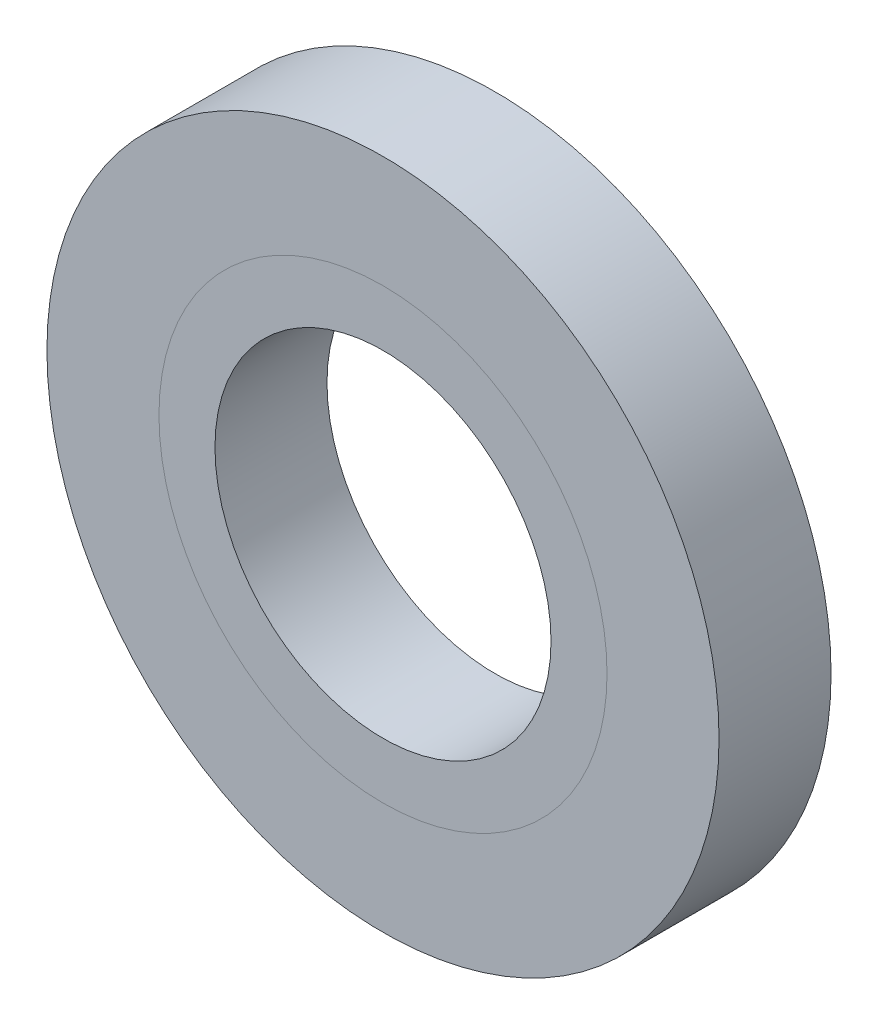
ISO-10303-21;
HEADER;
FILE_DESCRIPTION(('STEP AP214'),'2;1');
FILE_NAME('part.step','',(''),(''),'','','');
FILE_SCHEMA(('AUTOMOTIVE_DESIGN { 1 0 10303 214 1 1 1 1 }'));
ENDSEC;
DATA;
#1=APPLICATION_CONTEXT('core data for automotive mechanical design processes');
#2=APPLICATION_PROTOCOL_DEFINITION('international standard','automotive_design',2000,#1);
#3=PRODUCT_CONTEXT('',#1,'mechanical');
#4=PRODUCT('Part','Part','',(#3));
#5=PRODUCT_RELATED_PRODUCT_CATEGORY('part','',(#4));
#6=PRODUCT_DEFINITION_FORMATION('','',#4);
#7=PRODUCT_DEFINITION_CONTEXT('part definition',#1,'design');
#8=PRODUCT_DEFINITION('design','',#6,#7);
#9=PRODUCT_DEFINITION_SHAPE('','',#8);
#10=(LENGTH_UNIT() NAMED_UNIT(*) SI_UNIT(.MILLI.,.METRE.));
#11=(NAMED_UNIT(*) PLANE_ANGLE_UNIT() SI_UNIT($,.RADIAN.));
#12=(NAMED_UNIT(*) SI_UNIT($,.STERADIAN.) SOLID_ANGLE_UNIT());
#13=UNCERTAINTY_MEASURE_WITH_UNIT(LENGTH_MEASURE(1.E-05),#10,'distance_accuracy_value','');
#14=(GEOMETRIC_REPRESENTATION_CONTEXT(3) GLOBAL_UNCERTAINTY_ASSIGNED_CONTEXT((#13)) GLOBAL_UNIT_ASSIGNED_CONTEXT((#10,
#11,#12)) REPRESENTATION_CONTEXT('',''));
#15=CARTESIAN_POINT('',(0.,0.,0.));
#16=DIRECTION('',(0.,0.,1.));
#17=DIRECTION('',(1.,0.,0.));
#18=AXIS2_PLACEMENT_3D('',#15,#16,#17);
#19=CARTESIAN_POINT('',(0.,0.,0.));
#20=DIRECTION('',(0.,0.,1.));
#21=DIRECTION('',(1.,0.,0.));
#22=AXIS2_PLACEMENT_3D('',#19,#20,#21);
#23=PLANE('',#22);
#24=CARTESIAN_POINT('',(0.,0.,0.));
#25=DIRECTION('',(0.,0.,-1.));
#26=DIRECTION('',(1.,0.,0.));
#27=AXIS2_PLACEMENT_3D('',#24,#25,#26);
#28=CIRCLE('',#27,4.);
#29=CARTESIAN_POINT('',(-4.,0.,0.));
#30=VERTEX_POINT('',#29);
#31=EDGE_CURVE('P0_E20',#30,#30,#28,.T.);
#32=ORIENTED_EDGE('',*,*,#31,.F.);
#33=EDGE_LOOP('',(#32));
#34=FACE_BOUND('',#33,.T.);
#35=CARTESIAN_POINT('',(0.,0.,0.));
#36=DIRECTION('',(0.,0.,1.));
#37=DIRECTION('',(1.,0.,0.));
#38=AXIS2_PLACEMENT_3D('',#35,#36,#37);
#39=CIRCLE('',#38,6.);
#40=CARTESIAN_POINT('',(-6.,0.,0.));
#41=VERTEX_POINT('',#40);
#42=EDGE_CURVE('P0_E11',#41,#41,#39,.T.);
#43=ORIENTED_EDGE('',*,*,#42,.F.);
#44=EDGE_LOOP('',(#43));
#45=FACE_BOUND('',#44,.T.);
#46=ADVANCED_FACE('P0_F17',(#34,#45),#23,.F.);
#47=CARTESIAN_POINT('',(0.,0.,2.));
#48=DIRECTION('',(0.,0.,1.));
#49=DIRECTION('',(1.,0.,0.));
#50=AXIS2_PLACEMENT_3D('',#47,#48,#49);
#51=PLANE('',#50);
#52=CARTESIAN_POINT('',(0.,0.,2.));
#53=DIRECTION('',(0.,0.,-1.));
#54=DIRECTION('',(1.,0.,0.));
#55=AXIS2_PLACEMENT_3D('',#52,#53,#54);
#56=CIRCLE('',#55,4.);
#57=CARTESIAN_POINT('',(-4.,0.,2.));
#58=VERTEX_POINT('',#57);
#59=EDGE_CURVE('P0_E52',#58,#58,#56,.T.);
#60=ORIENTED_EDGE('',*,*,#59,.T.);
#61=EDGE_LOOP('',(#60));
#62=FACE_BOUND('',#61,.T.);
#63=CARTESIAN_POINT('',(0.,0.,2.));
#64=DIRECTION('',(0.,0.,1.));
#65=DIRECTION('',(1.,0.,0.));
#66=AXIS2_PLACEMENT_3D('',#63,#64,#65);
#67=CIRCLE('',#66,6.);
#68=CARTESIAN_POINT('',(-6.,0.,2.));
#69=VERTEX_POINT('',#68);
#70=EDGE_CURVE('P0_E27',#69,#69,#67,.T.);
#71=ORIENTED_EDGE('',*,*,#70,.T.);
#72=EDGE_LOOP('',(#71));
#73=FACE_BOUND('',#72,.T.);
#74=ADVANCED_FACE('P0_F61',(#62,#73),#51,.T.);
#75=CARTESIAN_POINT('',(0.,0.,0.));
#76=DIRECTION('',(0.,0.,1.));
#77=DIRECTION('',(1.,0.,0.));
#78=AXIS2_PLACEMENT_3D('',#75,#76,#77);
#79=CYLINDRICAL_SURFACE('',#78,6.);
#80=ORIENTED_EDGE('',*,*,#42,.T.);
#81=EDGE_LOOP('',(#80));
#82=FACE_BOUND('',#81,.T.);
#83=ORIENTED_EDGE('',*,*,#70,.F.);
#84=EDGE_LOOP('',(#83));
#85=FACE_BOUND('',#84,.T.);
#86=ADVANCED_FACE('P0_F64',(#82,#85),#79,.T.);
#87=CARTESIAN_POINT('',(0.,0.,0.));
#88=DIRECTION('',(0.,0.,1.));
#89=DIRECTION('',(1.,0.,0.));
#90=AXIS2_PLACEMENT_3D('',#87,#88,#89);
#91=CYLINDRICAL_SURFACE('',#90,4.);
#92=ORIENTED_EDGE('',*,*,#31,.T.);
#93=EDGE_LOOP('',(#92));
#94=FACE_BOUND('',#93,.T.);
#95=ORIENTED_EDGE('',*,*,#59,.F.);
#96=EDGE_LOOP('',(#95));
#97=FACE_BOUND('',#96,.T.);
#98=ADVANCED_FACE('P0_F48',(#94,#97),#91,.F.);
#99=CLOSED_SHELL('',(#46,#74,#86,#98));
#100=MANIFOLD_SOLID_BREP('P0_B1',#99);
#101=CARTESIAN_POINT('',(0.,0.,0.));
#102=DIRECTION('',(0.,0.,1.));
#103=DIRECTION('',(1.,0.,0.));
#104=AXIS2_PLACEMENT_3D('',#101,#102,#103);
#105=PLANE('',#104);
#106=CARTESIAN_POINT('',(0.,0.,0.));
#107=DIRECTION('',(0.,0.,-1.));
#108=DIRECTION('',(1.,0.,0.));
#109=AXIS2_PLACEMENT_3D('',#106,#107,#108);
#110=CIRCLE('',#109,3.);
#111=CARTESIAN_POINT('',(-3.,0.,0.));
#112=VERTEX_POINT('',#111);
#113=EDGE_CURVE('P1_E46',#112,#112,#110,.T.);
#114=ORIENTED_EDGE('',*,*,#113,.F.);
#115=EDGE_LOOP('',(#114));
#116=FACE_BOUND('',#115,.T.);
#117=CARTESIAN_POINT('',(0.,0.,0.));
#118=DIRECTION('',(0.,0.,1.));
#119=DIRECTION('',(1.,0.,0.));
#120=AXIS2_PLACEMENT_3D('',#117,#118,#119);
#121=CIRCLE('',#120,4.);
#122=CARTESIAN_POINT('',(-4.,0.,0.));
#123=VERTEX_POINT('',#122);
#124=EDGE_CURVE('P1_E11',#123,#123,#121,.T.);
#125=ORIENTED_EDGE('',*,*,#124,.F.);
#126=EDGE_LOOP('',(#125));
#127=FACE_BOUND('',#126,.T.);
#128=ADVANCED_FACE('P1_F17',(#116,#127),#105,.F.);
#129=CARTESIAN_POINT('',(0.,0.,2.));
#130=DIRECTION('',(0.,0.,1.));
#131=DIRECTION('',(1.,0.,0.));
#132=AXIS2_PLACEMENT_3D('',#129,#130,#131);
#133=PLANE('',#132);
#134=CARTESIAN_POINT('',(0.,0.,2.));
#135=DIRECTION('',(0.,0.,-1.));
#136=DIRECTION('',(1.,0.,0.));
#137=AXIS2_PLACEMENT_3D('',#134,#135,#136);
#138=CIRCLE('',#137,3.);
#139=CARTESIAN_POINT('',(-3.,0.,2.));
#140=VERTEX_POINT('',#139);
#141=EDGE_CURVE('P1_E52',#140,#140,#138,.T.);
#142=ORIENTED_EDGE('',*,*,#141,.T.);
#143=EDGE_LOOP('',(#142));
#144=FACE_BOUND('',#143,.T.);
#145=CARTESIAN_POINT('',(0.,0.,2.));
#146=DIRECTION('',(0.,0.,1.));
#147=DIRECTION('',(1.,0.,0.));
#148=AXIS2_PLACEMENT_3D('',#145,#146,#147);
#149=CIRCLE('',#148,4.);
#150=CARTESIAN_POINT('',(-4.,0.,2.));
#151=VERTEX_POINT('',#150);
#152=EDGE_CURVE('P1_E27',#151,#151,#149,.T.);
#153=ORIENTED_EDGE('',*,*,#152,.T.);
#154=EDGE_LOOP('',(#153));
#155=FACE_BOUND('',#154,.T.);
#156=ADVANCED_FACE('P1_F53',(#144,#155),#133,.T.);
#157=CARTESIAN_POINT('',(0.,0.,0.));
#158=DIRECTION('',(0.,0.,1.));
#159=DIRECTION('',(1.,0.,0.));
#160=AXIS2_PLACEMENT_3D('',#157,#158,#159);
#161=CYLINDRICAL_SURFACE('',#160,4.);
#162=ORIENTED_EDGE('',*,*,#124,.T.);
#163=EDGE_LOOP('',(#162));
#164=FACE_BOUND('',#163,.T.);
#165=ORIENTED_EDGE('',*,*,#152,.F.);
#166=EDGE_LOOP('',(#165));
#167=FACE_BOUND('',#166,.T.);
#168=ADVANCED_FACE('P1_F19',(#164,#167),#161,.T.);
#169=CARTESIAN_POINT('',(0.,0.,0.));
#170=DIRECTION('',(0.,0.,1.));
#171=DIRECTION('',(1.,0.,0.));
#172=AXIS2_PLACEMENT_3D('',#169,#170,#171);
#173=CYLINDRICAL_SURFACE('',#172,3.);
#174=ORIENTED_EDGE('',*,*,#113,.T.);
#175=EDGE_LOOP('',(#174));
#176=FACE_BOUND('',#175,.T.);
#177=ORIENTED_EDGE('',*,*,#141,.F.);
#178=EDGE_LOOP('',(#177));
#179=FACE_BOUND('',#178,.T.);
#180=ADVANCED_FACE('P1_F66',(#176,#179),#173,.F.);
#181=CLOSED_SHELL('',(#128,#156,#168,#180));
#182=MANIFOLD_SOLID_BREP('P1_B1',#181);
#183=ADVANCED_BREP_SHAPE_REPRESENTATION('',(#18,#100,#182),#14);
#184=SHAPE_DEFINITION_REPRESENTATION(#9,#183);
ENDSEC;
END-ISO-10303-21;
